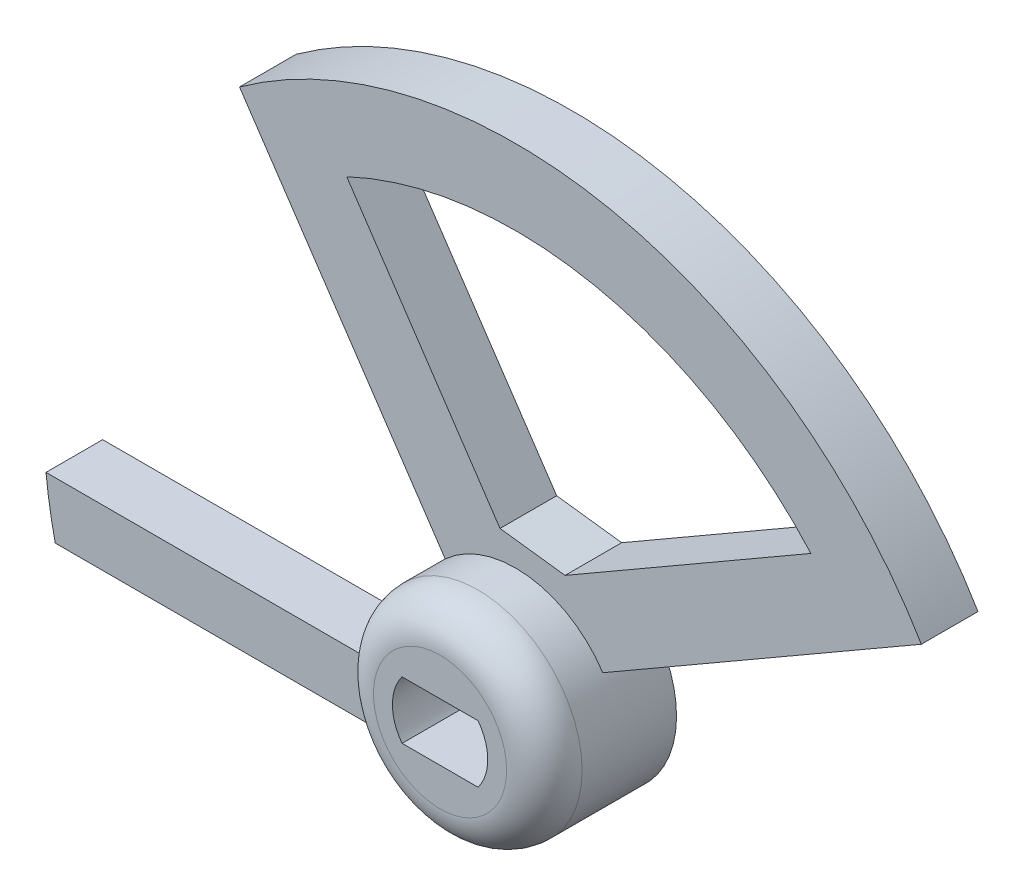
ISO-10303-21;
HEADER;
FILE_DESCRIPTION(('STEP AP214'),'2;1');
FILE_NAME('part.step','',(''),(''),'','','');
FILE_SCHEMA(('AUTOMOTIVE_DESIGN { 1 0 10303 214 1 1 1 1 }'));
ENDSEC;
DATA;
#1=APPLICATION_CONTEXT('core data for automotive mechanical design processes');
#2=APPLICATION_PROTOCOL_DEFINITION('international standard','automotive_design',2000,#1);
#3=PRODUCT_CONTEXT('',#1,'mechanical');
#4=PRODUCT('Part','Part','',(#3));
#5=PRODUCT_RELATED_PRODUCT_CATEGORY('part','',(#4));
#6=PRODUCT_DEFINITION_FORMATION('','',#4);
#7=PRODUCT_DEFINITION_CONTEXT('part definition',#1,'design');
#8=PRODUCT_DEFINITION('design','',#6,#7);
#9=PRODUCT_DEFINITION_SHAPE('','',#8);
#10=(LENGTH_UNIT() NAMED_UNIT(*) SI_UNIT(.MILLI.,.METRE.));
#11=(NAMED_UNIT(*) PLANE_ANGLE_UNIT() SI_UNIT($,.RADIAN.));
#12=(NAMED_UNIT(*) SI_UNIT($,.STERADIAN.) SOLID_ANGLE_UNIT());
#13=UNCERTAINTY_MEASURE_WITH_UNIT(LENGTH_MEASURE(1.E-05),#10,'distance_accuracy_value','');
#14=(GEOMETRIC_REPRESENTATION_CONTEXT(3) GLOBAL_UNCERTAINTY_ASSIGNED_CONTEXT((#13)) GLOBAL_UNIT_ASSIGNED_CONTEXT((#10,
#11,#12)) REPRESENTATION_CONTEXT('',''));
#15=CARTESIAN_POINT('',(0.,0.,0.));
#16=DIRECTION('',(0.,0.,1.));
#17=DIRECTION('',(1.,0.,0.));
#18=AXIS2_PLACEMENT_3D('',#15,#16,#17);
#19=CARTESIAN_POINT('',(0.,0.,3.));
#20=DIRECTION('',(0.,0.,1.));
#21=DIRECTION('',(1.,0.,0.));
#22=AXIS2_PLACEMENT_3D('',#19,#20,#21);
#23=PLANE('',#22);
#24=CARTESIAN_POINT('',(0.,0.,3.));
#25=DIRECTION('',(0.,0.,1.));
#26=DIRECTION('',(1.,0.,0.));
#27=AXIS2_PLACEMENT_3D('',#24,#25,#26);
#28=CIRCLE('',#27,5.525);
#29=CARTESIAN_POINT('',(4.61980513036416,3.03035073175714,3.));
#30=VERTEX_POINT('',#29);
#31=CARTESIAN_POINT('',(-3.72865693087295,4.07709976476577,3.));
#32=VERTEX_POINT('',#31);
#33=EDGE_CURVE('E177',#30,#32,#28,.T.);
#34=ORIENTED_EDGE('',*,*,#33,.F.);
#35=DIRECTION('',(0.866025403784438,0.500000000000001,0.));
#36=VECTOR('',#35,1.);
#37=CARTESIAN_POINT('',(-0.15722907544818,0.272328747103327,3.));
#38=LINE('',#37,#36);
#39=CARTESIAN_POINT('',(21.4916932315282,12.7713398687015,3.));
#40=VERTEX_POINT('',#39);
#41=EDGE_CURVE('E212',#30,#40,#38,.T.);
#42=ORIENTED_EDGE('',*,*,#41,.T.);
#43=CARTESIAN_POINT('',(0.,0.,3.));
#44=DIRECTION('',(0.,0.,1.));
#45=DIRECTION('',(1.,0.,0.));
#46=AXIS2_PLACEMENT_3D('',#43,#44,#45);
#47=CIRCLE('',#46,25.);
#48=CARTESIAN_POINT('',(-14.6227944655411,20.2774229629542,3.));
#49=VERTEX_POINT('',#48);
#50=EDGE_CURVE('E214',#40,#49,#47,.T.);
#51=ORIENTED_EDGE('',*,*,#50,.T.);
#52=DIRECTION('',(-0.558026399805345,0.829823196301649,0.));
#53=VECTOR('',#52,1.);
#54=CARTESIAN_POINT('',(-0.679622466748081,-0.457021784925375,3.));
#55=LINE('',#54,#53);
#56=EDGE_CURVE('E216',#32,#49,#55,.T.);
#57=ORIENTED_EDGE('',*,*,#56,.F.);
#58=EDGE_LOOP('',(#34,#42,#51,#57));
#59=FACE_BOUND('',#58,.T.);
#60=DIRECTION('',(0.866025403784438,0.500000000000002,0.));
#61=VECTOR('',#60,1.);
#62=CARTESIAN_POINT('',(-2.15722907544819,3.73643036224108,3.));
#63=LINE('',#62,#61);
#64=CARTESIAN_POINT('',(2.61980513036415,6.49445234689489,3.));
#65=VERTEX_POINT('',#64);
#66=CARTESIAN_POINT('',(15.6413407588987,14.0124394472916,3.));
#67=VERTEX_POINT('',#66);
#68=EDGE_CURVE('E52',#65,#67,#63,.T.);
#69=ORIENTED_EDGE('',*,*,#68,.F.);
#70=DIRECTION('',(-0.992231124671056,0.124408179932076,0.));
#71=VECTOR('',#70,1.);
#72=CARTESIAN_POINT('',(0.842233791784175,6.71732825698637,3.));
#73=LINE('',#72,#71);
#74=CARTESIAN_POINT('',(-0.824328522046704,6.92628560477752,3.));
#75=VERTEX_POINT('',#74);
#76=EDGE_CURVE('E189',#65,#75,#73,.T.);
#77=ORIENTED_EDGE('',*,*,#76,.T.);
#78=DIRECTION('',(-0.558026399805346,0.829823196301649,0.));
#79=VECTOR('',#78,1.);
#80=CARTESIAN_POINT('',(2.63967031845852,1.77508381429601,3.));
#81=LINE('',#80,#79);
#82=CARTESIAN_POINT('',(-8.9436623013957,19.0002869620065,3.));
#83=VERTEX_POINT('',#82);
#84=EDGE_CURVE('E200',#75,#83,#81,.T.);
#85=ORIENTED_EDGE('',*,*,#84,.T.);
#86=CARTESIAN_POINT('',(0.,0.,3.));
#87=DIRECTION('',(0.,0.,1.));
#88=DIRECTION('',(1.,0.,0.));
#89=AXIS2_PLACEMENT_3D('',#86,#87,#88);
#90=CIRCLE('',#89,21.);
#91=EDGE_CURVE('E198',#67,#83,#90,.T.);
#92=ORIENTED_EDGE('',*,*,#91,.F.);
#93=EDGE_LOOP('',(#69,#77,#85,#92));
#94=FACE_BOUND('',#93,.T.);
#95=ADVANCED_FACE('F37',(#59,#94),#23,.T.);
#96=CARTESIAN_POINT('',(0.,0.,3.));
#97=DIRECTION('',(0.,0.,-1.));
#98=DIRECTION('',(-1.,0.,0.));
#99=AXIS2_PLACEMENT_3D('',#96,#97,#98);
#100=CYLINDRICAL_SURFACE('',#99,2.525);
#101=CARTESIAN_POINT('',(0.,0.,0.));
#102=DIRECTION('',(0.,0.,1.));
#103=DIRECTION('',(1.,0.,0.));
#104=AXIS2_PLACEMENT_3D('',#101,#102,#103);
#105=CIRCLE('',#104,2.525);
#106=CARTESIAN_POINT('',(-2.01246117974981,1.525,0.));
#107=VERTEX_POINT('',#106);
#108=CARTESIAN_POINT('',(-2.01246117974981,-1.525,0.));
#109=VERTEX_POINT('',#108);
#110=EDGE_CURVE('E247',#107,#109,#105,.T.);
#111=ORIENTED_EDGE('',*,*,#110,.F.);
#112=DIRECTION('',(0.,0.,-1.));
#113=VECTOR('',#112,1.);
#114=CARTESIAN_POINT('',(-2.01246117974981,1.525,3.));
#115=LINE('',#114,#113);
#116=CARTESIAN_POINT('',(-2.01246117974981,1.525,7.));
#117=VERTEX_POINT('',#116);
#118=EDGE_CURVE('E167',#117,#107,#115,.T.);
#119=ORIENTED_EDGE('',*,*,#118,.F.);
#120=CARTESIAN_POINT('',(0.,0.,7.));
#121=DIRECTION('',(0.,0.,1.));
#122=DIRECTION('',(1.,0.,0.));
#123=AXIS2_PLACEMENT_3D('',#120,#121,#122);
#124=CIRCLE('',#123,2.525);
#125=CARTESIAN_POINT('',(-2.01246117974981,-1.525,7.));
#126=VERTEX_POINT('',#125);
#127=EDGE_CURVE('E165',#126,#117,#124,.F.);
#128=ORIENTED_EDGE('',*,*,#127,.F.);
#129=DIRECTION('',(0.,0.,-1.));
#130=VECTOR('',#129,1.);
#131=CARTESIAN_POINT('',(-2.01246117974981,-1.525,3.));
#132=LINE('',#131,#130);
#133=EDGE_CURVE('E151',#126,#109,#132,.T.);
#134=ORIENTED_EDGE('',*,*,#133,.T.);
#135=EDGE_LOOP('',(#111,#119,#128,#134));
#136=FACE_BOUND('',#135,.T.);
#137=ADVANCED_FACE('F166',(#136),#100,.F.);
#138=CARTESIAN_POINT('',(0.,1.525,3.));
#139=DIRECTION('',(0.,-1.,0.));
#140=DIRECTION('',(1.,0.,0.));
#141=AXIS2_PLACEMENT_3D('',#138,#139,#140);
#142=PLANE('',#141);
#143=DIRECTION('',(-1.,0.,0.));
#144=VECTOR('',#143,1.);
#145=CARTESIAN_POINT('',(0.,1.525,0.));
#146=LINE('',#145,#144);
#147=CARTESIAN_POINT('',(2.01246117974981,1.525,0.));
#148=VERTEX_POINT('',#147);
#149=EDGE_CURVE('E249',#148,#107,#146,.T.);
#150=ORIENTED_EDGE('',*,*,#149,.F.);
#151=DIRECTION('',(0.,0.,-1.));
#152=VECTOR('',#151,1.);
#153=CARTESIAN_POINT('',(2.01246117974981,1.525,3.));
#154=LINE('',#153,#152);
#155=CARTESIAN_POINT('',(2.01246117974981,1.525,7.));
#156=VERTEX_POINT('',#155);
#157=EDGE_CURVE('E257',#156,#148,#154,.T.);
#158=ORIENTED_EDGE('',*,*,#157,.F.);
#159=DIRECTION('',(1.,0.,0.));
#160=VECTOR('',#159,1.);
#161=CARTESIAN_POINT('',(0.,1.525,7.));
#162=LINE('',#161,#160);
#163=EDGE_CURVE('E171',#117,#156,#162,.T.);
#164=ORIENTED_EDGE('',*,*,#163,.F.);
#165=ORIENTED_EDGE('',*,*,#118,.T.);
#166=EDGE_LOOP('',(#150,#158,#164,#165));
#167=FACE_BOUND('',#166,.T.);
#168=ADVANCED_FACE('F332',(#167),#142,.T.);
#169=CARTESIAN_POINT('',(0.,0.,3.));
#170=DIRECTION('',(0.,0.,-1.));
#171=DIRECTION('',(-1.,0.,0.));
#172=AXIS2_PLACEMENT_3D('',#169,#170,#171);
#173=CYLINDRICAL_SURFACE('',#172,2.525);
#174=CARTESIAN_POINT('',(0.,0.,0.));
#175=DIRECTION('',(0.,0.,1.));
#176=DIRECTION('',(1.,0.,0.));
#177=AXIS2_PLACEMENT_3D('',#174,#175,#176);
#178=CIRCLE('',#177,2.525);
#179=CARTESIAN_POINT('',(2.01246117974981,-1.525,0.));
#180=VERTEX_POINT('',#179);
#181=EDGE_CURVE('E252',#180,#148,#178,.T.);
#182=ORIENTED_EDGE('',*,*,#181,.F.);
#183=DIRECTION('',(0.,0.,-1.));
#184=VECTOR('',#183,1.);
#185=CARTESIAN_POINT('',(2.01246117974981,-1.525,3.));
#186=LINE('',#185,#184);
#187=CARTESIAN_POINT('',(2.01246117974981,-1.525,7.));
#188=VERTEX_POINT('',#187);
#189=EDGE_CURVE('E161',#188,#180,#186,.T.);
#190=ORIENTED_EDGE('',*,*,#189,.F.);
#191=CARTESIAN_POINT('',(0.,0.,7.));
#192=DIRECTION('',(0.,0.,1.));
#193=DIRECTION('',(1.,0.,0.));
#194=AXIS2_PLACEMENT_3D('',#191,#192,#193);
#195=CIRCLE('',#194,2.525);
#196=EDGE_CURVE('E176',#156,#188,#195,.F.);
#197=ORIENTED_EDGE('',*,*,#196,.F.);
#198=ORIENTED_EDGE('',*,*,#157,.T.);
#199=EDGE_LOOP('',(#182,#190,#197,#198));
#200=FACE_BOUND('',#199,.T.);
#201=ADVANCED_FACE('F347',(#200),#173,.F.);
#202=CARTESIAN_POINT('',(-0.15722907544818,0.272328747103327,3.));
#203=DIRECTION('',(-0.500000000000001,0.866025403784438,0.));
#204=DIRECTION('',(-0.866025403784438,-0.500000000000001,0.));
#205=AXIS2_PLACEMENT_3D('',#202,#203,#204);
#206=PLANE('',#205);
#207=DIRECTION('',(0.866025403784438,0.500000000000001,0.));
#208=VECTOR('',#207,1.);
#209=CARTESIAN_POINT('',(-0.15722907544818,0.272328747103327,0.));
#210=LINE('',#209,#208);
#211=CARTESIAN_POINT('',(4.61980513036416,3.03035073175714,0.));
#212=VERTEX_POINT('',#211);
#213=CARTESIAN_POINT('',(21.4916932315282,12.7713398687015,0.));
#214=VERTEX_POINT('',#213);
#215=EDGE_CURVE('E229',#212,#214,#210,.T.);
#216=ORIENTED_EDGE('',*,*,#215,.T.);
#217=DIRECTION('',(0.,0.,-1.));
#218=VECTOR('',#217,1.);
#219=CARTESIAN_POINT('',(21.4916932315282,12.7713398687015,3.));
#220=LINE('',#219,#218);
#221=EDGE_CURVE('E273',#40,#214,#220,.T.);
#222=ORIENTED_EDGE('',*,*,#221,.F.);
#223=ORIENTED_EDGE('',*,*,#41,.F.);
#224=DIRECTION('',(0.,0.,-1.));
#225=VECTOR('',#224,1.);
#226=CARTESIAN_POINT('',(4.61980513036416,3.03035073175714,3.));
#227=LINE('',#226,#225);
#228=EDGE_CURVE('E162',#30,#212,#227,.T.);
#229=ORIENTED_EDGE('',*,*,#228,.T.);
#230=EDGE_LOOP('',(#216,#222,#223,#229));
#231=FACE_BOUND('',#230,.T.);
#232=ADVANCED_FACE('F305',(#231),#206,.F.);
#233=CARTESIAN_POINT('',(0.,0.,3.));
#234=DIRECTION('',(0.,0.,-1.));
#235=DIRECTION('',(-1.,0.,0.));
#236=AXIS2_PLACEMENT_3D('',#233,#234,#235);
#237=CYLINDRICAL_SURFACE('',#236,25.);
#238=CARTESIAN_POINT('',(0.,0.,0.));
#239=DIRECTION('',(0.,0.,1.));
#240=DIRECTION('',(1.,0.,0.));
#241=AXIS2_PLACEMENT_3D('',#238,#239,#240);
#242=CIRCLE('',#241,25.);
#243=CARTESIAN_POINT('',(-14.6227944655411,20.2774229629542,0.));
#244=VERTEX_POINT('',#243);
#245=EDGE_CURVE('E231',#214,#244,#242,.T.);
#246=ORIENTED_EDGE('',*,*,#245,.T.);
#247=DIRECTION('',(0.,0.,-1.));
#248=VECTOR('',#247,1.);
#249=CARTESIAN_POINT('',(-14.6227944655411,20.2774229629542,3.));
#250=LINE('',#249,#248);
#251=EDGE_CURVE('E271',#49,#244,#250,.T.);
#252=ORIENTED_EDGE('',*,*,#251,.F.);
#253=ORIENTED_EDGE('',*,*,#50,.F.);
#254=ORIENTED_EDGE('',*,*,#221,.T.);
#255=EDGE_LOOP('',(#246,#252,#253,#254));
#256=FACE_BOUND('',#255,.T.);
#257=ADVANCED_FACE('F370',(#256),#237,.T.);
#258=CARTESIAN_POINT('',(-0.679622466748081,-0.457021784925375,3.));
#259=DIRECTION('',(-0.829823196301649,-0.558026399805345,0.));
#260=DIRECTION('',(0.558026399805345,-0.829823196301649,0.));
#261=AXIS2_PLACEMENT_3D('',#258,#259,#260);
#262=PLANE('',#261);
#263=DIRECTION('',(-0.558026399805345,0.829823196301649,0.));
#264=VECTOR('',#263,1.);
#265=CARTESIAN_POINT('',(-0.679622466748081,-0.457021784925375,0.));
#266=LINE('',#265,#264);
#267=CARTESIAN_POINT('',(-3.72865693087295,4.07709976476577,0.));
#268=VERTEX_POINT('',#267);
#269=EDGE_CURVE('E234',#268,#244,#266,.T.);
#270=ORIENTED_EDGE('',*,*,#269,.F.);
#271=DIRECTION('',(0.,0.,-1.));
#272=VECTOR('',#271,1.);
#273=CARTESIAN_POINT('',(-3.72865693087295,4.07709976476577,3.));
#274=LINE('',#273,#272);
#275=EDGE_CURVE('E269',#32,#268,#274,.T.);
#276=ORIENTED_EDGE('',*,*,#275,.F.);
#277=ORIENTED_EDGE('',*,*,#56,.T.);
#278=ORIENTED_EDGE('',*,*,#251,.T.);
#279=EDGE_LOOP('',(#270,#276,#277,#278));
#280=FACE_BOUND('',#279,.T.);
#281=ADVANCED_FACE('F313',(#280),#262,.T.);
#282=CARTESIAN_POINT('',(0.,0.,3.));
#283=DIRECTION('',(0.,0.,-1.));
#284=DIRECTION('',(-1.,0.,0.));
#285=AXIS2_PLACEMENT_3D('',#282,#283,#284);
#286=CYLINDRICAL_SURFACE('',#285,5.525);
#287=CARTESIAN_POINT('',(0.,0.,5.));
#288=DIRECTION('',(0.,0.,1.));
#289=DIRECTION('',(1.,0.,0.));
#290=AXIS2_PLACEMENT_3D('',#287,#288,#289);
#291=CIRCLE('',#290,5.525);
#292=CARTESIAN_POINT('',(5.525,0.,5.));
#293=VERTEX_POINT('',#292);
#294=EDGE_CURVE('E11',#293,#293,#291,.F.);
#295=ORIENTED_EDGE('',*,*,#294,.T.);
#296=EDGE_LOOP('',(#295));
#297=FACE_BOUND('',#296,.T.);
#298=CARTESIAN_POINT('',(0.,0.,0.));
#299=DIRECTION('',(0.,0.,1.));
#300=DIRECTION('',(1.,0.,0.));
#301=AXIS2_PLACEMENT_3D('',#298,#299,#300);
#302=CIRCLE('',#301,5.525);
#303=CARTESIAN_POINT('',(-4.91426495012225,-2.525,0.));
#304=VERTEX_POINT('',#303);
#305=EDGE_CURVE('E237',#268,#304,#302,.T.);
#306=ORIENTED_EDGE('',*,*,#305,.T.);
#307=DIRECTION('',(0.,0.,-1.));
#308=VECTOR('',#307,1.);
#309=CARTESIAN_POINT('',(-4.91426495012225,-2.525,3.));
#310=LINE('',#309,#308);
#311=CARTESIAN_POINT('',(-4.91426495012225,-2.525,3.));
#312=VERTEX_POINT('',#311);
#313=EDGE_CURVE('E266',#312,#304,#310,.T.);
#314=ORIENTED_EDGE('',*,*,#313,.F.);
#315=CARTESIAN_POINT('',(0.,-5.525,3.));
#316=VERTEX_POINT('',#315);
#317=EDGE_CURVE('E181',#312,#316,#28,.T.);
#318=ORIENTED_EDGE('',*,*,#317,.T.);
#319=DIRECTION('',(0.,0.,-1.));
#320=VECTOR('',#319,1.);
#321=CARTESIAN_POINT('',(0.,-5.525,3.));
#322=LINE('',#321,#320);
#323=CARTESIAN_POINT('',(0.,-5.525,0.));
#324=VERTEX_POINT('',#323);
#325=EDGE_CURVE('E226',#316,#324,#322,.T.);
#326=ORIENTED_EDGE('',*,*,#325,.T.);
#327=CARTESIAN_POINT('',(0.,0.,0.));
#328=DIRECTION('',(0.,0.,1.));
#329=DIRECTION('',(1.,0.,0.));
#330=AXIS2_PLACEMENT_3D('',#327,#328,#329);
#331=CIRCLE('',#330,5.525);
#332=EDGE_CURVE('E207',#324,#212,#331,.T.);
#333=ORIENTED_EDGE('',*,*,#332,.T.);
#334=ORIENTED_EDGE('',*,*,#228,.F.);
#335=ORIENTED_EDGE('',*,*,#33,.T.);
#336=ORIENTED_EDGE('',*,*,#275,.T.);
#337=EDGE_LOOP('',(#306,#314,#318,#326,#333,#334,#335,#336));
#338=FACE_BOUND('',#337,.T.);
#339=ADVANCED_FACE('F283',(#297,#338),#286,.T.);
#340=CARTESIAN_POINT('',(0.,-2.525,3.));
#341=DIRECTION('',(0.,-1.,0.));
#342=DIRECTION('',(1.,0.,0.));
#343=AXIS2_PLACEMENT_3D('',#340,#341,#342);
#344=PLANE('',#343);
#345=DIRECTION('',(-1.,0.,0.));
#346=VECTOR('',#345,1.);
#347=CARTESIAN_POINT('',(0.,-2.525,0.));
#348=LINE('',#347,#346);
#349=CARTESIAN_POINT('',(-24.8721606419708,-2.525,0.));
#350=VERTEX_POINT('',#349);
#351=EDGE_CURVE('E239',#304,#350,#348,.T.);
#352=ORIENTED_EDGE('',*,*,#351,.T.);
#353=DIRECTION('',(0.,0.,-1.));
#354=VECTOR('',#353,1.);
#355=CARTESIAN_POINT('',(-24.8721606419708,-2.525,3.));
#356=LINE('',#355,#354);
#357=CARTESIAN_POINT('',(-24.8721606419708,-2.525,3.));
#358=VERTEX_POINT('',#357);
#359=EDGE_CURVE('E263',#358,#350,#356,.T.);
#360=ORIENTED_EDGE('',*,*,#359,.F.);
#361=DIRECTION('',(-1.,0.,0.));
#362=VECTOR('',#361,1.);
#363=CARTESIAN_POINT('',(0.,-2.525,3.));
#364=LINE('',#363,#362);
#365=EDGE_CURVE('E219',#312,#358,#364,.T.);
#366=ORIENTED_EDGE('',*,*,#365,.F.);
#367=ORIENTED_EDGE('',*,*,#313,.T.);
#368=EDGE_LOOP('',(#352,#360,#366,#367));
#369=FACE_BOUND('',#368,.T.);
#370=ADVANCED_FACE('F316',(#369),#344,.F.);
#371=CARTESIAN_POINT('',(0.,0.,3.));
#372=DIRECTION('',(0.,0.,-1.));
#373=DIRECTION('',(-1.,0.,0.));
#374=AXIS2_PLACEMENT_3D('',#371,#372,#373);
#375=CYLINDRICAL_SURFACE('',#374,25.);
#376=CARTESIAN_POINT('',(0.,0.,0.));
#377=DIRECTION('',(0.,0.,1.));
#378=DIRECTION('',(1.,0.,0.));
#379=AXIS2_PLACEMENT_3D('',#376,#377,#378);
#380=CIRCLE('',#379,25.);
#381=CARTESIAN_POINT('',(-24.3818451926838,-5.525,0.));
#382=VERTEX_POINT('',#381);
#383=EDGE_CURVE('E241',#350,#382,#380,.T.);
#384=ORIENTED_EDGE('',*,*,#383,.T.);
#385=DIRECTION('',(0.,0.,-1.));
#386=VECTOR('',#385,1.);
#387=CARTESIAN_POINT('',(-24.3818451926838,-5.525,3.));
#388=LINE('',#387,#386);
#389=CARTESIAN_POINT('',(-24.3818451926838,-5.525,3.));
#390=VERTEX_POINT('',#389);
#391=EDGE_CURVE('E261',#390,#382,#388,.T.);
#392=ORIENTED_EDGE('',*,*,#391,.F.);
#393=CARTESIAN_POINT('',(0.,0.,3.));
#394=DIRECTION('',(0.,0.,1.));
#395=DIRECTION('',(1.,0.,0.));
#396=AXIS2_PLACEMENT_3D('',#393,#394,#395);
#397=CIRCLE('',#396,25.);
#398=EDGE_CURVE('E221',#358,#390,#397,.T.);
#399=ORIENTED_EDGE('',*,*,#398,.F.);
#400=ORIENTED_EDGE('',*,*,#359,.T.);
#401=EDGE_LOOP('',(#384,#392,#399,#400));
#402=FACE_BOUND('',#401,.T.);
#403=ADVANCED_FACE('F318',(#402),#375,.T.);
#404=CARTESIAN_POINT('',(0.,-5.525,3.));
#405=DIRECTION('',(0.,-1.,0.));
#406=DIRECTION('',(1.,0.,0.));
#407=AXIS2_PLACEMENT_3D('',#404,#405,#406);
#408=PLANE('',#407);
#409=DIRECTION('',(-1.,0.,0.));
#410=VECTOR('',#409,1.);
#411=CARTESIAN_POINT('',(0.,-5.525,0.));
#412=LINE('',#411,#410);
#413=EDGE_CURVE('E244',#324,#382,#412,.T.);
#414=ORIENTED_EDGE('',*,*,#413,.F.);
#415=ORIENTED_EDGE('',*,*,#325,.F.);
#416=DIRECTION('',(-1.,0.,0.));
#417=VECTOR('',#416,1.);
#418=CARTESIAN_POINT('',(0.,-5.525,3.));
#419=LINE('',#418,#417);
#420=EDGE_CURVE('E223',#316,#390,#419,.T.);
#421=ORIENTED_EDGE('',*,*,#420,.T.);
#422=ORIENTED_EDGE('',*,*,#391,.T.);
#423=EDGE_LOOP('',(#414,#415,#421,#422));
#424=FACE_BOUND('',#423,.T.);
#425=ADVANCED_FACE('F294',(#424),#408,.T.);
#426=CARTESIAN_POINT('',(0.,-1.525,3.));
#427=DIRECTION('',(0.,-1.,0.));
#428=DIRECTION('',(1.,0.,0.));
#429=AXIS2_PLACEMENT_3D('',#426,#427,#428);
#430=PLANE('',#429);
#431=DIRECTION('',(-1.,0.,0.));
#432=VECTOR('',#431,1.);
#433=CARTESIAN_POINT('',(0.,-1.525,0.));
#434=LINE('',#433,#432);
#435=EDGE_CURVE('E157',#180,#109,#434,.T.);
#436=ORIENTED_EDGE('',*,*,#435,.T.);
#437=ORIENTED_EDGE('',*,*,#133,.F.);
#438=DIRECTION('',(-1.,0.,0.));
#439=VECTOR('',#438,1.);
#440=CARTESIAN_POINT('',(0.,-1.525,7.));
#441=LINE('',#440,#439);
#442=EDGE_CURVE('E155',#188,#126,#441,.T.);
#443=ORIENTED_EDGE('',*,*,#442,.F.);
#444=ORIENTED_EDGE('',*,*,#189,.T.);
#445=EDGE_LOOP('',(#436,#437,#443,#444));
#446=FACE_BOUND('',#445,.T.);
#447=ADVANCED_FACE('F153',(#446),#430,.F.);
#448=ORIENTED_EDGE('',*,*,#317,.F.);
#449=ORIENTED_EDGE('',*,*,#365,.T.);
#450=ORIENTED_EDGE('',*,*,#398,.T.);
#451=ORIENTED_EDGE('',*,*,#420,.F.);
#452=EDGE_LOOP('',(#448,#449,#450,#451));
#453=FACE_BOUND('',#452,.T.);
#454=ADVANCED_FACE('F288',(#453),#23,.T.);
#455=CARTESIAN_POINT('',(0.,0.,0.));
#456=DIRECTION('',(0.,0.,1.));
#457=DIRECTION('',(1.,0.,0.));
#458=AXIS2_PLACEMENT_3D('',#455,#456,#457);
#459=PLANE('',#458);
#460=DIRECTION('',(-0.992231124671056,0.124408179932076,0.));
#461=VECTOR('',#460,1.);
#462=CARTESIAN_POINT('',(0.842233791784175,6.71732825698637,0.));
#463=LINE('',#462,#461);
#464=CARTESIAN_POINT('',(2.61980513036415,6.49445234689489,0.));
#465=VERTEX_POINT('',#464);
#466=CARTESIAN_POINT('',(-0.824328522046704,6.92628560477752,0.));
#467=VERTEX_POINT('',#466);
#468=EDGE_CURVE('E194',#465,#467,#463,.T.);
#469=ORIENTED_EDGE('',*,*,#468,.F.);
#470=DIRECTION('',(0.866025403784438,0.500000000000002,0.));
#471=VECTOR('',#470,1.);
#472=CARTESIAN_POINT('',(-2.15722907544819,3.73643036224108,0.));
#473=LINE('',#472,#471);
#474=CARTESIAN_POINT('',(15.6413407588987,14.0124394472916,0.));
#475=VERTEX_POINT('',#474);
#476=EDGE_CURVE('E185',#465,#475,#473,.T.);
#477=ORIENTED_EDGE('',*,*,#476,.T.);
#478=CARTESIAN_POINT('',(0.,0.,0.));
#479=DIRECTION('',(0.,0.,1.));
#480=DIRECTION('',(1.,0.,0.));
#481=AXIS2_PLACEMENT_3D('',#478,#479,#480);
#482=CIRCLE('',#481,21.);
#483=CARTESIAN_POINT('',(-8.9436623013957,19.0002869620065,0.));
#484=VERTEX_POINT('',#483);
#485=EDGE_CURVE('E188',#475,#484,#482,.T.);
#486=ORIENTED_EDGE('',*,*,#485,.T.);
#487=DIRECTION('',(-0.558026399805346,0.829823196301649,0.));
#488=VECTOR('',#487,1.);
#489=CARTESIAN_POINT('',(2.63967031845852,1.77508381429601,0.));
#490=LINE('',#489,#488);
#491=EDGE_CURVE('E192',#467,#484,#490,.T.);
#492=ORIENTED_EDGE('',*,*,#491,.F.);
#493=EDGE_LOOP('',(#469,#477,#486,#492));
#494=FACE_BOUND('',#493,.T.);
#495=ORIENTED_EDGE('',*,*,#332,.F.);
#496=ORIENTED_EDGE('',*,*,#413,.T.);
#497=ORIENTED_EDGE('',*,*,#383,.F.);
#498=ORIENTED_EDGE('',*,*,#351,.F.);
#499=ORIENTED_EDGE('',*,*,#305,.F.);
#500=ORIENTED_EDGE('',*,*,#269,.T.);
#501=ORIENTED_EDGE('',*,*,#245,.F.);
#502=ORIENTED_EDGE('',*,*,#215,.F.);
#503=EDGE_LOOP('',(#495,#496,#497,#498,#499,#500,#501,#502));
#504=FACE_BOUND('',#503,.T.);
#505=ORIENTED_EDGE('',*,*,#110,.T.);
#506=ORIENTED_EDGE('',*,*,#435,.F.);
#507=ORIENTED_EDGE('',*,*,#181,.T.);
#508=ORIENTED_EDGE('',*,*,#149,.T.);
#509=EDGE_LOOP('',(#505,#506,#507,#508));
#510=FACE_BOUND('',#509,.T.);
#511=ADVANCED_FACE('F297',(#494,#504,#510),#459,.F.);
#512=CARTESIAN_POINT('',(-2.15722907544819,3.73643036224108,0.));
#513=DIRECTION('',(0.500000000000001,-0.866025403784438,0.));
#514=DIRECTION('',(0.866025403784438,0.500000000000002,0.));
#515=AXIS2_PLACEMENT_3D('',#512,#513,#514);
#516=PLANE('',#515);
#517=ORIENTED_EDGE('',*,*,#68,.T.);
#518=DIRECTION('',(0.,0.,1.));
#519=VECTOR('',#518,1.);
#520=CARTESIAN_POINT('',(15.6413407588987,14.0124394472916,0.));
#521=LINE('',#520,#519);
#522=EDGE_CURVE('E196',#475,#67,#521,.T.);
#523=ORIENTED_EDGE('',*,*,#522,.F.);
#524=ORIENTED_EDGE('',*,*,#476,.F.);
#525=DIRECTION('',(0.,0.,1.));
#526=VECTOR('',#525,1.);
#527=CARTESIAN_POINT('',(2.61980513036415,6.49445234689489,0.));
#528=LINE('',#527,#526);
#529=EDGE_CURVE('E205',#465,#65,#528,.T.);
#530=ORIENTED_EDGE('',*,*,#529,.T.);
#531=EDGE_LOOP('',(#517,#523,#524,#530));
#532=FACE_BOUND('',#531,.T.);
#533=ADVANCED_FACE('F341',(#532),#516,.F.);
#534=CARTESIAN_POINT('',(0.842233791784175,6.71732825698637,0.));
#535=DIRECTION('',(0.124408179932076,0.992231124671056,0.));
#536=DIRECTION('',(-0.992231124671056,0.124408179932076,0.));
#537=AXIS2_PLACEMENT_3D('',#534,#535,#536);
#538=PLANE('',#537);
#539=ORIENTED_EDGE('',*,*,#76,.F.);
#540=ORIENTED_EDGE('',*,*,#529,.F.);
#541=ORIENTED_EDGE('',*,*,#468,.T.);
#542=DIRECTION('',(0.,0.,1.));
#543=VECTOR('',#542,1.);
#544=CARTESIAN_POINT('',(-0.824328522046704,6.92628560477752,0.));
#545=LINE('',#544,#543);
#546=EDGE_CURVE('E208',#467,#75,#545,.T.);
#547=ORIENTED_EDGE('',*,*,#546,.T.);
#548=EDGE_LOOP('',(#539,#540,#541,#547));
#549=FACE_BOUND('',#548,.T.);
#550=ADVANCED_FACE('F450',(#549),#538,.T.);
#551=CARTESIAN_POINT('',(2.63967031845852,1.77508381429601,0.));
#552=DIRECTION('',(0.829823196301649,0.558026399805346,0.));
#553=DIRECTION('',(-0.558026399805346,0.829823196301649,0.));
#554=AXIS2_PLACEMENT_3D('',#551,#552,#553);
#555=PLANE('',#554);
#556=ORIENTED_EDGE('',*,*,#84,.F.);
#557=ORIENTED_EDGE('',*,*,#546,.F.);
#558=ORIENTED_EDGE('',*,*,#491,.T.);
#559=DIRECTION('',(0.,0.,1.));
#560=VECTOR('',#559,1.);
#561=CARTESIAN_POINT('',(-8.9436623013957,19.0002869620065,0.));
#562=LINE('',#561,#560);
#563=EDGE_CURVE('E60',#484,#83,#562,.T.);
#564=ORIENTED_EDGE('',*,*,#563,.T.);
#565=EDGE_LOOP('',(#556,#557,#558,#564));
#566=FACE_BOUND('',#565,.T.);
#567=ADVANCED_FACE('F457',(#566),#555,.T.);
#568=CARTESIAN_POINT('',(0.,0.,0.));
#569=DIRECTION('',(0.,0.,1.));
#570=DIRECTION('',(1.,0.,0.));
#571=AXIS2_PLACEMENT_3D('',#568,#569,#570);
#572=CYLINDRICAL_SURFACE('',#571,21.);
#573=ORIENTED_EDGE('',*,*,#91,.T.);
#574=ORIENTED_EDGE('',*,*,#563,.F.);
#575=ORIENTED_EDGE('',*,*,#485,.F.);
#576=ORIENTED_EDGE('',*,*,#522,.T.);
#577=EDGE_LOOP('',(#573,#574,#575,#576));
#578=FACE_BOUND('',#577,.T.);
#579=ADVANCED_FACE('F466',(#578),#572,.F.);
#580=CARTESIAN_POINT('',(0.,0.,7.));
#581=DIRECTION('',(0.,0.,1.));
#582=DIRECTION('',(1.,0.,0.));
#583=AXIS2_PLACEMENT_3D('',#580,#581,#582);
#584=PLANE('',#583);
#585=CARTESIAN_POINT('',(0.,0.,7.));
#586=DIRECTION('',(0.,0.,1.));
#587=DIRECTION('',(1.,0.,0.));
#588=AXIS2_PLACEMENT_3D('',#585,#586,#587);
#589=CIRCLE('',#588,3.525);
#590=CARTESIAN_POINT('',(3.525,0.,7.));
#591=VERTEX_POINT('',#590);
#592=EDGE_CURVE('E45',#591,#591,#589,.T.);
#593=ORIENTED_EDGE('',*,*,#592,.T.);
#594=EDGE_LOOP('',(#593));
#595=FACE_BOUND('',#594,.T.);
#596=ORIENTED_EDGE('',*,*,#442,.T.);
#597=ORIENTED_EDGE('',*,*,#127,.T.);
#598=ORIENTED_EDGE('',*,*,#163,.T.);
#599=ORIENTED_EDGE('',*,*,#196,.T.);
#600=EDGE_LOOP('',(#596,#597,#598,#599));
#601=FACE_BOUND('',#600,.T.);
#602=ADVANCED_FACE('F174',(#595,#601),#584,.T.);
#603=CARTESIAN_POINT('',(0.,0.,5.));
#604=DIRECTION('',(0.,0.,1.));
#605=DIRECTION('',(1.,0.,0.));
#606=AXIS2_PLACEMENT_3D('',#603,#604,#605);
#607=TOROIDAL_SURFACE('',#606,3.525,2.);
#608=ORIENTED_EDGE('',*,*,#294,.F.);
#609=EDGE_LOOP('',(#608));
#610=FACE_BOUND('',#609,.T.);
#611=ORIENTED_EDGE('',*,*,#592,.F.);
#612=EDGE_LOOP('',(#611));
#613=FACE_BOUND('',#612,.T.);
#614=ADVANCED_FACE('F39',(#610,#613),#607,.T.);
#615=CLOSED_SHELL('',(#95,#137,#168,#201,#232,#257,#281,#339,#370,#403,#425,#447,#454,#511,#533,
#550,#567,#579,#602,#614));
#616=MANIFOLD_SOLID_BREP('B2',#615);
#617=ADVANCED_BREP_SHAPE_REPRESENTATION('',(#18,#616),#14);
#618=SHAPE_DEFINITION_REPRESENTATION(#9,#617);
ENDSEC;
END-ISO-10303-21;
